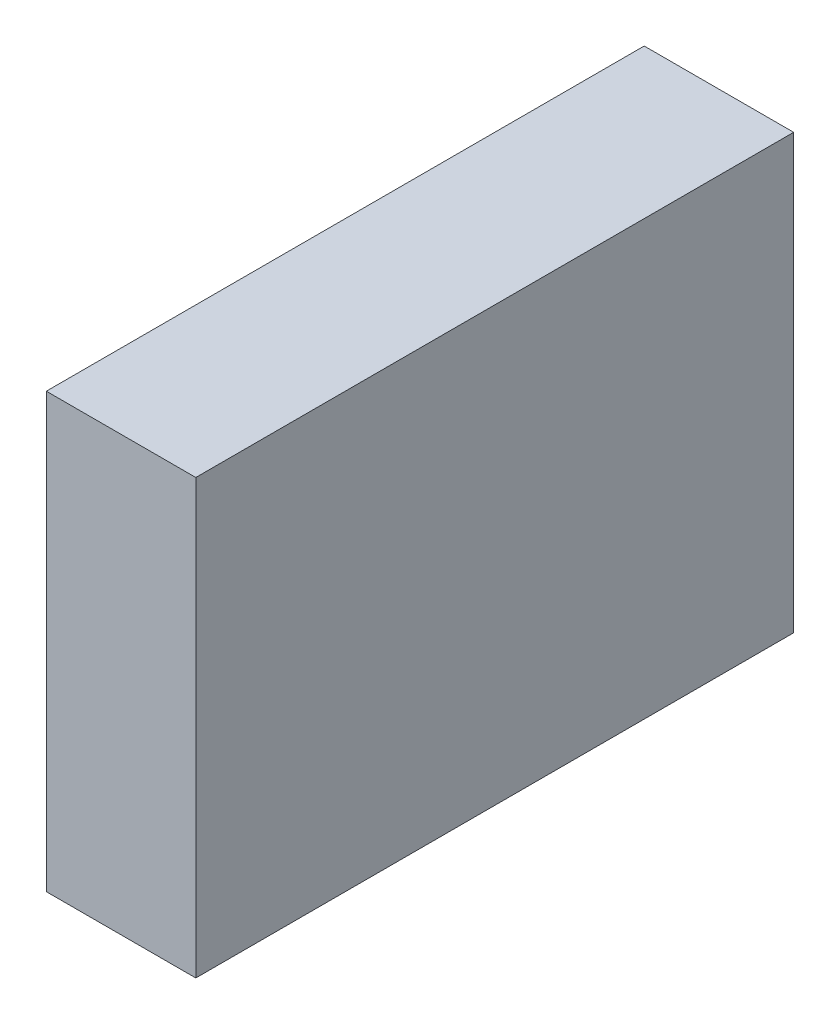
ISO-10303-21;
HEADER;
FILE_DESCRIPTION(('STEP AP214'),'2;1');
FILE_NAME('part.step','',(''),(''),'','','');
FILE_SCHEMA(('AUTOMOTIVE_DESIGN { 1 0 10303 214 1 1 1 1 }'));
ENDSEC;
DATA;
#1=APPLICATION_CONTEXT('core data for automotive mechanical design processes');
#2=APPLICATION_PROTOCOL_DEFINITION('international standard','automotive_design',2000,#1);
#3=PRODUCT_CONTEXT('',#1,'mechanical');
#4=PRODUCT('Part','Part','',(#3));
#5=PRODUCT_RELATED_PRODUCT_CATEGORY('part','',(#4));
#6=PRODUCT_DEFINITION_FORMATION('','',#4);
#7=PRODUCT_DEFINITION_CONTEXT('part definition',#1,'design');
#8=PRODUCT_DEFINITION('design','',#6,#7);
#9=PRODUCT_DEFINITION_SHAPE('','',#8);
#10=(LENGTH_UNIT() NAMED_UNIT(*) SI_UNIT(.MILLI.,.METRE.));
#11=(NAMED_UNIT(*) PLANE_ANGLE_UNIT() SI_UNIT($,.RADIAN.));
#12=(NAMED_UNIT(*) SI_UNIT($,.STERADIAN.) SOLID_ANGLE_UNIT());
#13=UNCERTAINTY_MEASURE_WITH_UNIT(LENGTH_MEASURE(1.E-05),#10,'distance_accuracy_value','');
#14=(GEOMETRIC_REPRESENTATION_CONTEXT(3) GLOBAL_UNCERTAINTY_ASSIGNED_CONTEXT((#13)) GLOBAL_UNIT_ASSIGNED_CONTEXT((#10,
#11,#12)) REPRESENTATION_CONTEXT('',''));
#15=CARTESIAN_POINT('',(0.,0.,0.));
#16=DIRECTION('',(0.,0.,1.));
#17=DIRECTION('',(1.,0.,0.));
#18=AXIS2_PLACEMENT_3D('',#15,#16,#17);
#19=CARTESIAN_POINT('',(10.,0.,0.));
#20=DIRECTION('',(0.,0.,-1.));
#21=DIRECTION('',(-1.,0.,0.));
#22=AXIS2_PLACEMENT_3D('',#19,#20,#21);
#23=PLANE('',#22);
#24=DIRECTION('',(0.,-1.,0.));
#25=VECTOR('',#24,1.);
#26=CARTESIAN_POINT('',(0.,0.,0.));
#27=LINE('',#26,#25);
#28=CARTESIAN_POINT('',(0.,29.,0.));
#29=VERTEX_POINT('',#28);
#30=CARTESIAN_POINT('',(0.,0.,0.));
#31=VERTEX_POINT('',#30);
#32=EDGE_CURVE('E105',#29,#31,#27,.T.);
#33=ORIENTED_EDGE('',*,*,#32,.T.);
#34=DIRECTION('',(-1.,0.,0.));
#35=VECTOR('',#34,1.);
#36=CARTESIAN_POINT('',(10.,0.,0.));
#37=LINE('',#36,#35);
#38=CARTESIAN_POINT('',(10.,0.,0.));
#39=VERTEX_POINT('',#38);
#40=EDGE_CURVE('E11',#39,#31,#37,.T.);
#41=ORIENTED_EDGE('',*,*,#40,.F.);
#42=DIRECTION('',(0.,-1.,0.));
#43=VECTOR('',#42,1.);
#44=CARTESIAN_POINT('',(10.,0.,0.));
#45=LINE('',#44,#43);
#46=CARTESIAN_POINT('',(10.,29.,0.));
#47=VERTEX_POINT('',#46);
#48=EDGE_CURVE('E89',#47,#39,#45,.T.);
#49=ORIENTED_EDGE('',*,*,#48,.F.);
#50=DIRECTION('',(-1.,0.,0.));
#51=VECTOR('',#50,1.);
#52=CARTESIAN_POINT('',(10.,29.,0.));
#53=LINE('',#52,#51);
#54=EDGE_CURVE('E97',#47,#29,#53,.T.);
#55=ORIENTED_EDGE('',*,*,#54,.T.);
#56=EDGE_LOOP('',(#33,#41,#49,#55));
#57=FACE_BOUND('',#56,.T.);
#58=ADVANCED_FACE('F39',(#57),#23,.F.);
#59=CARTESIAN_POINT('',(10.,0.,0.));
#60=DIRECTION('',(0.,1.,0.));
#61=DIRECTION('',(0.,0.,1.));
#62=AXIS2_PLACEMENT_3D('',#59,#60,#61);
#63=PLANE('',#62);
#64=DIRECTION('',(0.,0.,-1.));
#65=VECTOR('',#64,1.);
#66=CARTESIAN_POINT('',(0.,0.,0.));
#67=LINE('',#66,#65);
#68=CARTESIAN_POINT('',(0.,0.,-40.));
#69=VERTEX_POINT('',#68);
#70=EDGE_CURVE('E92',#31,#69,#67,.T.);
#71=ORIENTED_EDGE('',*,*,#70,.T.);
#72=DIRECTION('',(-1.,0.,0.));
#73=VECTOR('',#72,1.);
#74=CARTESIAN_POINT('',(10.,0.,-40.));
#75=LINE('',#74,#73);
#76=CARTESIAN_POINT('',(10.,0.,-40.));
#77=VERTEX_POINT('',#76);
#78=EDGE_CURVE('E50',#77,#69,#75,.T.);
#79=ORIENTED_EDGE('',*,*,#78,.F.);
#80=DIRECTION('',(0.,0.,-1.));
#81=VECTOR('',#80,1.);
#82=CARTESIAN_POINT('',(10.,0.,0.));
#83=LINE('',#82,#81);
#84=EDGE_CURVE('E82',#39,#77,#83,.T.);
#85=ORIENTED_EDGE('',*,*,#84,.F.);
#86=ORIENTED_EDGE('',*,*,#40,.T.);
#87=EDGE_LOOP('',(#71,#79,#85,#86));
#88=FACE_BOUND('',#87,.T.);
#89=ADVANCED_FACE('F93',(#88),#63,.F.);
#90=CARTESIAN_POINT('',(10.,0.,-40.));
#91=DIRECTION('',(0.,0.,1.));
#92=DIRECTION('',(1.,0.,0.));
#93=AXIS2_PLACEMENT_3D('',#90,#91,#92);
#94=PLANE('',#93);
#95=DIRECTION('',(0.,1.,0.));
#96=VECTOR('',#95,1.);
#97=CARTESIAN_POINT('',(0.,0.,-40.));
#98=LINE('',#97,#96);
#99=CARTESIAN_POINT('',(0.,29.,-40.));
#100=VERTEX_POINT('',#99);
#101=EDGE_CURVE('E72',#69,#100,#98,.T.);
#102=ORIENTED_EDGE('',*,*,#101,.T.);
#103=DIRECTION('',(-1.,0.,0.));
#104=VECTOR('',#103,1.);
#105=CARTESIAN_POINT('',(10.,29.,-40.));
#106=LINE('',#105,#104);
#107=CARTESIAN_POINT('',(10.,29.,-40.));
#108=VERTEX_POINT('',#107);
#109=EDGE_CURVE('E94',#108,#100,#106,.T.);
#110=ORIENTED_EDGE('',*,*,#109,.F.);
#111=DIRECTION('',(0.,1.,0.));
#112=VECTOR('',#111,1.);
#113=CARTESIAN_POINT('',(10.,0.,-40.));
#114=LINE('',#113,#112);
#115=EDGE_CURVE('E88',#77,#108,#114,.T.);
#116=ORIENTED_EDGE('',*,*,#115,.F.);
#117=ORIENTED_EDGE('',*,*,#78,.T.);
#118=EDGE_LOOP('',(#102,#110,#116,#117));
#119=FACE_BOUND('',#118,.T.);
#120=ADVANCED_FACE('F96',(#119),#94,.F.);
#121=CARTESIAN_POINT('',(10.,29.,0.));
#122=DIRECTION('',(0.,-1.,0.));
#123=DIRECTION('',(0.,0.,-1.));
#124=AXIS2_PLACEMENT_3D('',#121,#122,#123);
#125=PLANE('',#124);
#126=DIRECTION('',(0.,0.,1.));
#127=VECTOR('',#126,1.);
#128=CARTESIAN_POINT('',(0.,29.,0.));
#129=LINE('',#128,#127);
#130=EDGE_CURVE('E76',#100,#29,#129,.T.);
#131=ORIENTED_EDGE('',*,*,#130,.T.);
#132=ORIENTED_EDGE('',*,*,#54,.F.);
#133=DIRECTION('',(0.,0.,1.));
#134=VECTOR('',#133,1.);
#135=CARTESIAN_POINT('',(10.,29.,0.));
#136=LINE('',#135,#134);
#137=EDGE_CURVE('E54',#108,#47,#136,.T.);
#138=ORIENTED_EDGE('',*,*,#137,.F.);
#139=ORIENTED_EDGE('',*,*,#109,.T.);
#140=EDGE_LOOP('',(#131,#132,#138,#139));
#141=FACE_BOUND('',#140,.T.);
#142=ADVANCED_FACE('F108',(#141),#125,.F.);
#143=CARTESIAN_POINT('',(10.,0.,0.));
#144=DIRECTION('',(-1.,0.,0.));
#145=DIRECTION('',(0.,0.,1.));
#146=AXIS2_PLACEMENT_3D('',#143,#144,#145);
#147=PLANE('',#146);
#148=ORIENTED_EDGE('',*,*,#48,.T.);
#149=ORIENTED_EDGE('',*,*,#84,.T.);
#150=ORIENTED_EDGE('',*,*,#115,.T.);
#151=ORIENTED_EDGE('',*,*,#137,.T.);
#152=EDGE_LOOP('',(#148,#149,#150,#151));
#153=FACE_BOUND('',#152,.T.);
#154=ADVANCED_FACE('F86',(#153),#147,.F.);
#155=CARTESIAN_POINT('',(0.,0.,0.));
#156=DIRECTION('',(-1.,0.,0.));
#157=DIRECTION('',(0.,0.,1.));
#158=AXIS2_PLACEMENT_3D('',#155,#156,#157);
#159=PLANE('',#158);
#160=ORIENTED_EDGE('',*,*,#32,.F.);
#161=ORIENTED_EDGE('',*,*,#130,.F.);
#162=ORIENTED_EDGE('',*,*,#101,.F.);
#163=ORIENTED_EDGE('',*,*,#70,.F.);
#164=EDGE_LOOP('',(#160,#161,#162,#163));
#165=FACE_BOUND('',#164,.T.);
#166=ADVANCED_FACE('F115',(#165),#159,.T.);
#167=CLOSED_SHELL('',(#58,#89,#120,#142,#154,#166));
#168=MANIFOLD_SOLID_BREP('B2',#167);
#169=ADVANCED_BREP_SHAPE_REPRESENTATION('',(#18,#168),#14);
#170=SHAPE_DEFINITION_REPRESENTATION(#9,#169);
ENDSEC;
END-ISO-10303-21;
